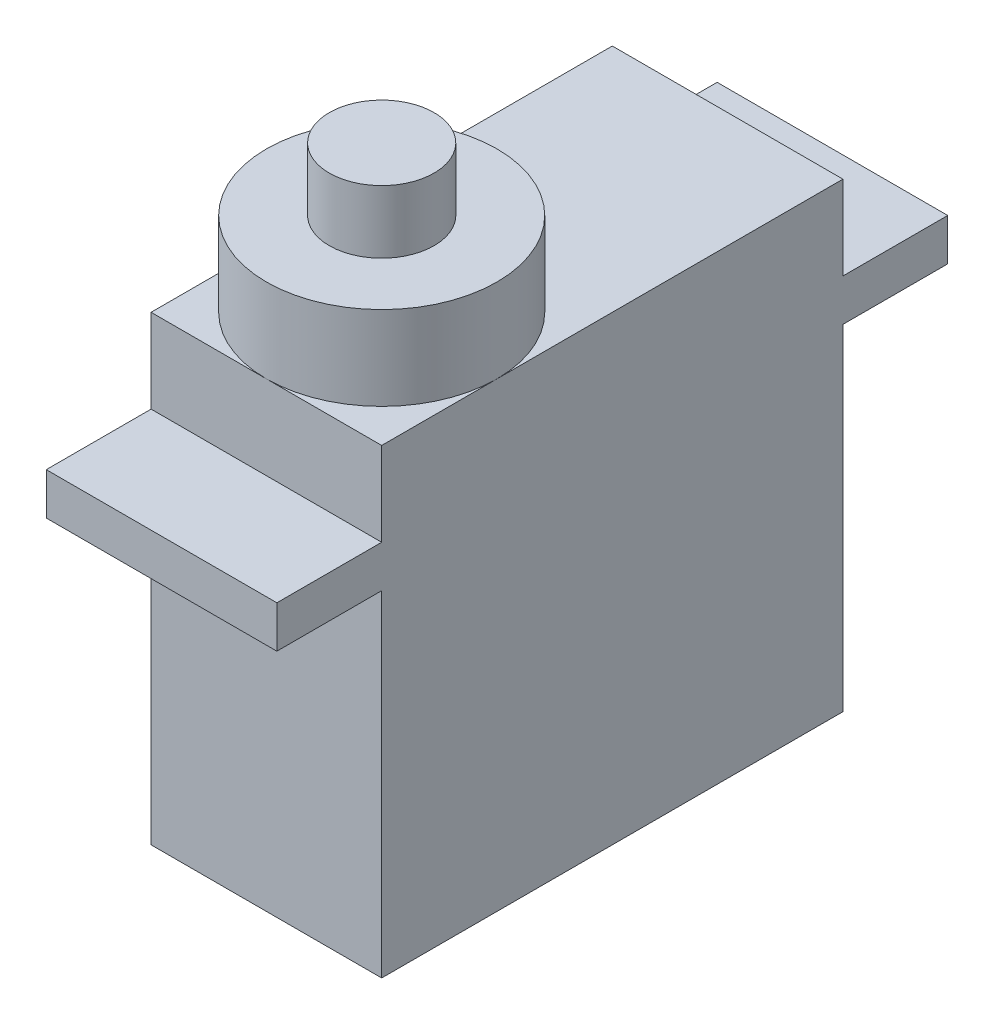
ISO-10303-21;
HEADER;
FILE_DESCRIPTION(('STEP AP214'),'2;1');
FILE_NAME('part.step','',(''),(''),'','','');
FILE_SCHEMA(('AUTOMOTIVE_DESIGN { 1 0 10303 214 1 1 1 1 }'));
ENDSEC;
DATA;
#1=APPLICATION_CONTEXT('core data for automotive mechanical design processes');
#2=APPLICATION_PROTOCOL_DEFINITION('international standard','automotive_design',2000,#1);
#3=PRODUCT_CONTEXT('',#1,'mechanical');
#4=PRODUCT('Part','Part','',(#3));
#5=PRODUCT_RELATED_PRODUCT_CATEGORY('part','',(#4));
#6=PRODUCT_DEFINITION_FORMATION('','',#4);
#7=PRODUCT_DEFINITION_CONTEXT('part definition',#1,'design');
#8=PRODUCT_DEFINITION('design','',#6,#7);
#9=PRODUCT_DEFINITION_SHAPE('','',#8);
#10=(LENGTH_UNIT() NAMED_UNIT(*) SI_UNIT(.MILLI.,.METRE.));
#11=(NAMED_UNIT(*) PLANE_ANGLE_UNIT() SI_UNIT($,.RADIAN.));
#12=(NAMED_UNIT(*) SI_UNIT($,.STERADIAN.) SOLID_ANGLE_UNIT());
#13=UNCERTAINTY_MEASURE_WITH_UNIT(LENGTH_MEASURE(1.E-05),#10,'distance_accuracy_value','');
#14=(GEOMETRIC_REPRESENTATION_CONTEXT(3) GLOBAL_UNCERTAINTY_ASSIGNED_CONTEXT((#13)) GLOBAL_UNIT_ASSIGNED_CONTEXT((#10,
#11,#12)) REPRESENTATION_CONTEXT('',''));
#15=CARTESIAN_POINT('',(0.,0.,0.));
#16=DIRECTION('',(0.,0.,1.));
#17=DIRECTION('',(1.,0.,0.));
#18=AXIS2_PLACEMENT_3D('',#15,#16,#17);
#19=CARTESIAN_POINT('',(0.,22.,0.));
#20=DIRECTION('',(0.,1.,0.));
#21=DIRECTION('',(0.,0.,1.));
#22=AXIS2_PLACEMENT_3D('',#19,#20,#21);
#23=PLANE('',#22);
#24=CARTESIAN_POINT('',(0.,22.,5.5));
#25=DIRECTION('',(0.,1.,0.));
#26=DIRECTION('',(0.,0.,1.));
#27=AXIS2_PLACEMENT_3D('',#24,#25,#26);
#28=CIRCLE('',#27,5.5);
#29=CARTESIAN_POINT('',(0.,22.,11.));
#30=VERTEX_POINT('',#29);
#31=CARTESIAN_POINT('',(5.5,22.,5.5));
#32=VERTEX_POINT('',#31);
#33=EDGE_CURVE('E159',#30,#32,#28,.T.);
#34=ORIENTED_EDGE('',*,*,#33,.F.);
#35=DIRECTION('',(1.,0.,0.));
#36=VECTOR('',#35,1.);
#37=CARTESIAN_POINT('',(5.5,22.,11.));
#38=LINE('',#37,#36);
#39=CARTESIAN_POINT('',(5.5,22.,11.));
#40=VERTEX_POINT('',#39);
#41=EDGE_CURVE('E146',#30,#40,#38,.T.);
#42=ORIENTED_EDGE('',*,*,#41,.T.);
#43=DIRECTION('',(0.,0.,-1.));
#44=VECTOR('',#43,1.);
#45=CARTESIAN_POINT('',(5.5,22.,11.));
#46=LINE('',#45,#44);
#47=EDGE_CURVE('E160',#40,#32,#46,.T.);
#48=ORIENTED_EDGE('',*,*,#47,.T.);
#49=EDGE_LOOP('',(#34,#42,#48));
#50=FACE_BOUND('',#49,.T.);
#51=ADVANCED_FACE('F39',(#50),#23,.T.);
#52=CARTESIAN_POINT('',(-5.5,22.,5.5));
#53=VERTEX_POINT('',#52);
#54=EDGE_CURVE('E49',#32,#53,#28,.T.);
#55=ORIENTED_EDGE('',*,*,#54,.F.);
#56=CARTESIAN_POINT('',(5.5,22.,-11.));
#57=VERTEX_POINT('',#56);
#58=EDGE_CURVE('E145',#32,#57,#46,.T.);
#59=ORIENTED_EDGE('',*,*,#58,.T.);
#60=DIRECTION('',(-1.,0.,0.));
#61=VECTOR('',#60,1.);
#62=CARTESIAN_POINT('',(5.5,22.,-11.));
#63=LINE('',#62,#61);
#64=CARTESIAN_POINT('',(-5.5,22.,-11.));
#65=VERTEX_POINT('',#64);
#66=EDGE_CURVE('E253',#57,#65,#63,.T.);
#67=ORIENTED_EDGE('',*,*,#66,.T.);
#68=DIRECTION('',(0.,0.,1.));
#69=VECTOR('',#68,1.);
#70=CARTESIAN_POINT('',(-5.5,22.,11.));
#71=LINE('',#70,#69);
#72=EDGE_CURVE('E157',#65,#53,#71,.T.);
#73=ORIENTED_EDGE('',*,*,#72,.T.);
#74=EDGE_LOOP('',(#55,#59,#67,#73));
#75=FACE_BOUND('',#74,.T.);
#76=ADVANCED_FACE('F334',(#75),#23,.T.);
#77=CARTESIAN_POINT('',(5.5,22.,11.));
#78=DIRECTION('',(0.,0.,-1.));
#79=DIRECTION('',(-1.,0.,0.));
#80=AXIS2_PLACEMENT_3D('',#77,#78,#79);
#81=PLANE('',#80);
#82=DIRECTION('',(-1.,0.,0.));
#83=VECTOR('',#82,1.);
#84=CARTESIAN_POINT('',(5.5,18.,11.));
#85=LINE('',#84,#83);
#86=CARTESIAN_POINT('',(5.5,18.,11.));
#87=VERTEX_POINT('',#86);
#88=CARTESIAN_POINT('',(-5.5,18.,11.));
#89=VERTEX_POINT('',#88);
#90=EDGE_CURVE('E189',#87,#89,#85,.T.);
#91=ORIENTED_EDGE('',*,*,#90,.F.);
#92=DIRECTION('',(0.,-1.,0.));
#93=VECTOR('',#92,1.);
#94=CARTESIAN_POINT('',(5.5,22.,11.));
#95=LINE('',#94,#93);
#96=EDGE_CURVE('E152',#40,#87,#95,.T.);
#97=ORIENTED_EDGE('',*,*,#96,.F.);
#98=ORIENTED_EDGE('',*,*,#41,.F.);
#99=CARTESIAN_POINT('',(-5.5,22.,11.));
#100=VERTEX_POINT('',#99);
#101=EDGE_CURVE('E138',#100,#30,#38,.T.);
#102=ORIENTED_EDGE('',*,*,#101,.F.);
#103=DIRECTION('',(0.,-1.,0.));
#104=VECTOR('',#103,1.);
#105=CARTESIAN_POINT('',(-5.5,22.,11.));
#106=LINE('',#105,#104);
#107=EDGE_CURVE('E43',#100,#89,#106,.T.);
#108=ORIENTED_EDGE('',*,*,#107,.T.);
#109=EDGE_LOOP('',(#91,#97,#98,#102,#108));
#110=FACE_BOUND('',#109,.T.);
#111=ADVANCED_FACE('F150',(#110),#81,.F.);
#112=CARTESIAN_POINT('',(5.5,22.,-11.));
#113=DIRECTION('',(0.,0.,1.));
#114=DIRECTION('',(1.,0.,0.));
#115=AXIS2_PLACEMENT_3D('',#112,#113,#114);
#116=PLANE('',#115);
#117=DIRECTION('',(-1.,0.,0.));
#118=VECTOR('',#117,1.);
#119=CARTESIAN_POINT('',(5.5,16.,-11.));
#120=LINE('',#119,#118);
#121=CARTESIAN_POINT('',(5.5,16.,-11.));
#122=VERTEX_POINT('',#121);
#123=CARTESIAN_POINT('',(-5.5,16.,-11.));
#124=VERTEX_POINT('',#123);
#125=EDGE_CURVE('E210',#122,#124,#120,.T.);
#126=ORIENTED_EDGE('',*,*,#125,.F.);
#127=DIRECTION('',(0.,-1.,0.));
#128=VECTOR('',#127,1.);
#129=CARTESIAN_POINT('',(5.5,22.,-11.));
#130=LINE('',#129,#128);
#131=CARTESIAN_POINT('',(5.5,0.,-11.));
#132=VERTEX_POINT('',#131);
#133=EDGE_CURVE('E276',#122,#132,#130,.T.);
#134=ORIENTED_EDGE('',*,*,#133,.T.);
#135=DIRECTION('',(-1.,0.,0.));
#136=VECTOR('',#135,1.);
#137=CARTESIAN_POINT('',(5.5,0.,-11.));
#138=LINE('',#137,#136);
#139=CARTESIAN_POINT('',(-5.5,0.,-11.));
#140=VERTEX_POINT('',#139);
#141=EDGE_CURVE('E268',#132,#140,#138,.T.);
#142=ORIENTED_EDGE('',*,*,#141,.T.);
#143=DIRECTION('',(0.,-1.,0.));
#144=VECTOR('',#143,1.);
#145=CARTESIAN_POINT('',(-5.5,22.,-11.));
#146=LINE('',#145,#144);
#147=EDGE_CURVE('E256',#124,#140,#146,.T.);
#148=ORIENTED_EDGE('',*,*,#147,.F.);
#149=EDGE_LOOP('',(#126,#134,#142,#148));
#150=FACE_BOUND('',#149,.T.);
#151=ADVANCED_FACE('F297',(#150),#116,.F.);
#152=CARTESIAN_POINT('',(-5.5,22.,11.));
#153=DIRECTION('',(1.,0.,0.));
#154=DIRECTION('',(0.,0.,-1.));
#155=AXIS2_PLACEMENT_3D('',#152,#153,#154);
#156=PLANE('',#155);
#157=DIRECTION('',(0.,0.,1.));
#158=VECTOR('',#157,1.);
#159=CARTESIAN_POINT('',(-5.5,0.,11.));
#160=LINE('',#159,#158);
#161=CARTESIAN_POINT('',(-5.5,0.,11.));
#162=VERTEX_POINT('',#161);
#163=EDGE_CURVE('E248',#140,#162,#160,.T.);
#164=ORIENTED_EDGE('',*,*,#163,.T.);
#165=CARTESIAN_POINT('',(-5.5,16.,11.));
#166=VERTEX_POINT('',#165);
#167=EDGE_CURVE('E170',#166,#162,#106,.T.);
#168=ORIENTED_EDGE('',*,*,#167,.F.);
#169=DIRECTION('',(0.,0.,-1.));
#170=VECTOR('',#169,1.);
#171=CARTESIAN_POINT('',(-5.5,16.,16.));
#172=LINE('',#171,#170);
#173=CARTESIAN_POINT('',(-5.5,16.,16.));
#174=VERTEX_POINT('',#173);
#175=EDGE_CURVE('E198',#174,#166,#172,.T.);
#176=ORIENTED_EDGE('',*,*,#175,.F.);
#177=DIRECTION('',(0.,-1.,0.));
#178=VECTOR('',#177,1.);
#179=CARTESIAN_POINT('',(-5.5,18.,16.));
#180=LINE('',#179,#178);
#181=CARTESIAN_POINT('',(-5.5,18.,16.));
#182=VERTEX_POINT('',#181);
#183=EDGE_CURVE('E181',#182,#174,#180,.T.);
#184=ORIENTED_EDGE('',*,*,#183,.F.);
#185=DIRECTION('',(0.,0.,-1.));
#186=VECTOR('',#185,1.);
#187=CARTESIAN_POINT('',(-5.5,18.,16.));
#188=LINE('',#187,#186);
#189=EDGE_CURVE('E202',#182,#89,#188,.T.);
#190=ORIENTED_EDGE('',*,*,#189,.T.);
#191=ORIENTED_EDGE('',*,*,#107,.F.);
#192=EDGE_CURVE('E141',#53,#100,#71,.T.);
#193=ORIENTED_EDGE('',*,*,#192,.F.);
#194=ORIENTED_EDGE('',*,*,#72,.F.);
#195=CARTESIAN_POINT('',(-5.5,18.,-11.));
#196=VERTEX_POINT('',#195);
#197=EDGE_CURVE('E272',#65,#196,#146,.T.);
#198=ORIENTED_EDGE('',*,*,#197,.T.);
#199=DIRECTION('',(0.,0.,1.));
#200=VECTOR('',#199,1.);
#201=CARTESIAN_POINT('',(-5.5,18.,-16.));
#202=LINE('',#201,#200);
#203=CARTESIAN_POINT('',(-5.5,18.,-16.));
#204=VERTEX_POINT('',#203);
#205=EDGE_CURVE('E236',#204,#196,#202,.T.);
#206=ORIENTED_EDGE('',*,*,#205,.F.);
#207=DIRECTION('',(0.,-1.,0.));
#208=VECTOR('',#207,1.);
#209=CARTESIAN_POINT('',(-5.5,18.,-16.));
#210=LINE('',#209,#208);
#211=CARTESIAN_POINT('',(-5.5,16.,-16.));
#212=VERTEX_POINT('',#211);
#213=EDGE_CURVE('E219',#204,#212,#210,.T.);
#214=ORIENTED_EDGE('',*,*,#213,.T.);
#215=DIRECTION('',(0.,0.,1.));
#216=VECTOR('',#215,1.);
#217=CARTESIAN_POINT('',(-5.5,16.,-16.));
#218=LINE('',#217,#216);
#219=EDGE_CURVE('E240',#212,#124,#218,.T.);
#220=ORIENTED_EDGE('',*,*,#219,.T.);
#221=ORIENTED_EDGE('',*,*,#147,.T.);
#222=EDGE_LOOP('',(#164,#168,#176,#184,#190,#191,#193,#194,#198,#206,#214,#220,#221));
#223=FACE_BOUND('',#222,.T.);
#224=ADVANCED_FACE('F41',(#223),#156,.F.);
#225=CARTESIAN_POINT('',(5.5,16.,11.));
#226=VERTEX_POINT('',#225);
#227=CARTESIAN_POINT('',(5.5,0.,11.));
#228=VERTEX_POINT('',#227);
#229=EDGE_CURVE('E279',#226,#228,#95,.T.);
#230=ORIENTED_EDGE('',*,*,#229,.F.);
#231=DIRECTION('',(-1.,0.,0.));
#232=VECTOR('',#231,1.);
#233=CARTESIAN_POINT('',(5.5,16.,11.));
#234=LINE('',#233,#232);
#235=EDGE_CURVE('E178',#226,#166,#234,.T.);
#236=ORIENTED_EDGE('',*,*,#235,.T.);
#237=ORIENTED_EDGE('',*,*,#167,.T.);
#238=DIRECTION('',(1.,0.,0.));
#239=VECTOR('',#238,1.);
#240=CARTESIAN_POINT('',(5.5,0.,11.));
#241=LINE('',#240,#239);
#242=EDGE_CURVE('E260',#162,#228,#241,.T.);
#243=ORIENTED_EDGE('',*,*,#242,.T.);
#244=EDGE_LOOP('',(#230,#236,#237,#243));
#245=FACE_BOUND('',#244,.T.);
#246=ADVANCED_FACE('F291',(#245),#81,.F.);
#247=CARTESIAN_POINT('',(5.5,22.,11.));
#248=DIRECTION('',(-1.,0.,0.));
#249=DIRECTION('',(0.,0.,1.));
#250=AXIS2_PLACEMENT_3D('',#247,#248,#249);
#251=PLANE('',#250);
#252=DIRECTION('',(0.,0.,-1.));
#253=VECTOR('',#252,1.);
#254=CARTESIAN_POINT('',(5.5,0.,11.));
#255=LINE('',#254,#253);
#256=EDGE_CURVE('E264',#228,#132,#255,.T.);
#257=ORIENTED_EDGE('',*,*,#256,.T.);
#258=ORIENTED_EDGE('',*,*,#133,.F.);
#259=DIRECTION('',(0.,0.,1.));
#260=VECTOR('',#259,1.);
#261=CARTESIAN_POINT('',(5.5,16.,-16.));
#262=LINE('',#261,#260);
#263=CARTESIAN_POINT('',(5.5,16.,-16.));
#264=VERTEX_POINT('',#263);
#265=EDGE_CURVE('E244',#264,#122,#262,.T.);
#266=ORIENTED_EDGE('',*,*,#265,.F.);
#267=DIRECTION('',(0.,-1.,0.));
#268=VECTOR('',#267,1.);
#269=CARTESIAN_POINT('',(5.5,18.,-16.));
#270=LINE('',#269,#268);
#271=CARTESIAN_POINT('',(5.5,18.,-16.));
#272=VERTEX_POINT('',#271);
#273=EDGE_CURVE('E211',#272,#264,#270,.T.);
#274=ORIENTED_EDGE('',*,*,#273,.F.);
#275=DIRECTION('',(0.,0.,1.));
#276=VECTOR('',#275,1.);
#277=CARTESIAN_POINT('',(5.5,18.,-16.));
#278=LINE('',#277,#276);
#279=CARTESIAN_POINT('',(5.5,18.,-11.));
#280=VERTEX_POINT('',#279);
#281=EDGE_CURVE('E227',#272,#280,#278,.T.);
#282=ORIENTED_EDGE('',*,*,#281,.T.);
#283=EDGE_CURVE('E277',#57,#280,#130,.T.);
#284=ORIENTED_EDGE('',*,*,#283,.F.);
#285=ORIENTED_EDGE('',*,*,#58,.F.);
#286=ORIENTED_EDGE('',*,*,#47,.F.);
#287=ORIENTED_EDGE('',*,*,#96,.T.);
#288=DIRECTION('',(0.,0.,-1.));
#289=VECTOR('',#288,1.);
#290=CARTESIAN_POINT('',(5.5,18.,16.));
#291=LINE('',#290,#289);
#292=CARTESIAN_POINT('',(5.5,18.,16.));
#293=VERTEX_POINT('',#292);
#294=EDGE_CURVE('E206',#293,#87,#291,.T.);
#295=ORIENTED_EDGE('',*,*,#294,.F.);
#296=DIRECTION('',(0.,-1.,0.));
#297=VECTOR('',#296,1.);
#298=CARTESIAN_POINT('',(5.5,18.,16.));
#299=LINE('',#298,#297);
#300=CARTESIAN_POINT('',(5.5,16.,16.));
#301=VERTEX_POINT('',#300);
#302=EDGE_CURVE('E173',#293,#301,#299,.T.);
#303=ORIENTED_EDGE('',*,*,#302,.T.);
#304=DIRECTION('',(0.,0.,-1.));
#305=VECTOR('',#304,1.);
#306=CARTESIAN_POINT('',(5.5,16.,16.));
#307=LINE('',#306,#305);
#308=EDGE_CURVE('E188',#301,#226,#307,.T.);
#309=ORIENTED_EDGE('',*,*,#308,.T.);
#310=ORIENTED_EDGE('',*,*,#229,.T.);
#311=EDGE_LOOP('',(#257,#258,#266,#274,#282,#284,#285,#286,#287,#295,#303,#309,#310));
#312=FACE_BOUND('',#311,.T.);
#313=ADVANCED_FACE('F284',(#312),#251,.F.);
#314=ORIENTED_EDGE('',*,*,#283,.T.);
#315=DIRECTION('',(-1.,0.,0.));
#316=VECTOR('',#315,1.);
#317=CARTESIAN_POINT('',(5.5,18.,-11.));
#318=LINE('',#317,#316);
#319=EDGE_CURVE('E216',#280,#196,#318,.T.);
#320=ORIENTED_EDGE('',*,*,#319,.T.);
#321=ORIENTED_EDGE('',*,*,#197,.F.);
#322=ORIENTED_EDGE('',*,*,#66,.F.);
#323=EDGE_LOOP('',(#314,#320,#321,#322));
#324=FACE_BOUND('',#323,.T.);
#325=ADVANCED_FACE('F342',(#324),#116,.F.);
#326=EDGE_CURVE('E64',#53,#30,#28,.T.);
#327=ORIENTED_EDGE('',*,*,#326,.F.);
#328=ORIENTED_EDGE('',*,*,#192,.T.);
#329=ORIENTED_EDGE('',*,*,#101,.T.);
#330=EDGE_LOOP('',(#327,#328,#329));
#331=FACE_BOUND('',#330,.T.);
#332=ADVANCED_FACE('F140',(#331),#23,.T.);
#333=CARTESIAN_POINT('',(0.,0.,0.));
#334=DIRECTION('',(0.,1.,0.));
#335=DIRECTION('',(0.,0.,1.));
#336=AXIS2_PLACEMENT_3D('',#333,#334,#335);
#337=PLANE('',#336);
#338=ORIENTED_EDGE('',*,*,#163,.F.);
#339=ORIENTED_EDGE('',*,*,#141,.F.);
#340=ORIENTED_EDGE('',*,*,#256,.F.);
#341=ORIENTED_EDGE('',*,*,#242,.F.);
#342=EDGE_LOOP('',(#338,#339,#340,#341));
#343=FACE_BOUND('',#342,.T.);
#344=ADVANCED_FACE('F295',(#343),#337,.F.);
#345=CARTESIAN_POINT('',(5.5,16.,-16.));
#346=DIRECTION('',(0.,1.,0.));
#347=DIRECTION('',(0.,0.,1.));
#348=AXIS2_PLACEMENT_3D('',#345,#346,#347);
#349=PLANE('',#348);
#350=ORIENTED_EDGE('',*,*,#125,.T.);
#351=ORIENTED_EDGE('',*,*,#219,.F.);
#352=DIRECTION('',(-1.,0.,0.));
#353=VECTOR('',#352,1.);
#354=CARTESIAN_POINT('',(5.5,16.,-16.));
#355=LINE('',#354,#353);
#356=EDGE_CURVE('E215',#264,#212,#355,.T.);
#357=ORIENTED_EDGE('',*,*,#356,.F.);
#358=ORIENTED_EDGE('',*,*,#265,.T.);
#359=EDGE_LOOP('',(#350,#351,#357,#358));
#360=FACE_BOUND('',#359,.T.);
#361=ADVANCED_FACE('F347',(#360),#349,.F.);
#362=CARTESIAN_POINT('',(5.5,18.,-16.));
#363=DIRECTION('',(0.,1.,0.));
#364=DIRECTION('',(0.,0.,1.));
#365=AXIS2_PLACEMENT_3D('',#362,#363,#364);
#366=PLANE('',#365);
#367=ORIENTED_EDGE('',*,*,#319,.F.);
#368=ORIENTED_EDGE('',*,*,#281,.F.);
#369=DIRECTION('',(-1.,0.,0.));
#370=VECTOR('',#369,1.);
#371=CARTESIAN_POINT('',(5.5,18.,-16.));
#372=LINE('',#371,#370);
#373=EDGE_CURVE('E223',#272,#204,#372,.T.);
#374=ORIENTED_EDGE('',*,*,#373,.T.);
#375=ORIENTED_EDGE('',*,*,#205,.T.);
#376=EDGE_LOOP('',(#367,#368,#374,#375));
#377=FACE_BOUND('',#376,.T.);
#378=ADVANCED_FACE('F447',(#377),#366,.T.);
#379=CARTESIAN_POINT('',(0.,0.,-16.));
#380=DIRECTION('',(0.,0.,-1.));
#381=DIRECTION('',(-1.,0.,0.));
#382=AXIS2_PLACEMENT_3D('',#379,#380,#381);
#383=PLANE('',#382);
#384=ORIENTED_EDGE('',*,*,#273,.T.);
#385=ORIENTED_EDGE('',*,*,#356,.T.);
#386=ORIENTED_EDGE('',*,*,#213,.F.);
#387=ORIENTED_EDGE('',*,*,#373,.F.);
#388=EDGE_LOOP('',(#384,#385,#386,#387));
#389=FACE_BOUND('',#388,.T.);
#390=ADVANCED_FACE('F437',(#389),#383,.T.);
#391=CARTESIAN_POINT('',(5.5,18.,16.));
#392=DIRECTION('',(0.,-1.,0.));
#393=DIRECTION('',(0.,0.,-1.));
#394=AXIS2_PLACEMENT_3D('',#391,#392,#393);
#395=PLANE('',#394);
#396=ORIENTED_EDGE('',*,*,#90,.T.);
#397=ORIENTED_EDGE('',*,*,#189,.F.);
#398=DIRECTION('',(-1.,0.,0.));
#399=VECTOR('',#398,1.);
#400=CARTESIAN_POINT('',(5.5,18.,16.));
#401=LINE('',#400,#399);
#402=EDGE_CURVE('E177',#293,#182,#401,.T.);
#403=ORIENTED_EDGE('',*,*,#402,.F.);
#404=ORIENTED_EDGE('',*,*,#294,.T.);
#405=EDGE_LOOP('',(#396,#397,#403,#404));
#406=FACE_BOUND('',#405,.T.);
#407=ADVANCED_FACE('F430',(#406),#395,.F.);
#408=CARTESIAN_POINT('',(5.5,16.,16.));
#409=DIRECTION('',(0.,-1.,0.));
#410=DIRECTION('',(0.,0.,-1.));
#411=AXIS2_PLACEMENT_3D('',#408,#409,#410);
#412=PLANE('',#411);
#413=ORIENTED_EDGE('',*,*,#235,.F.);
#414=ORIENTED_EDGE('',*,*,#308,.F.);
#415=DIRECTION('',(-1.,0.,0.));
#416=VECTOR('',#415,1.);
#417=CARTESIAN_POINT('',(5.5,16.,16.));
#418=LINE('',#417,#416);
#419=EDGE_CURVE('E184',#301,#174,#418,.T.);
#420=ORIENTED_EDGE('',*,*,#419,.T.);
#421=ORIENTED_EDGE('',*,*,#175,.T.);
#422=EDGE_LOOP('',(#413,#414,#420,#421));
#423=FACE_BOUND('',#422,.T.);
#424=ADVANCED_FACE('F330',(#423),#412,.T.);
#425=CARTESIAN_POINT('',(0.,0.,16.));
#426=DIRECTION('',(0.,0.,1.));
#427=DIRECTION('',(-1.,0.,0.));
#428=AXIS2_PLACEMENT_3D('',#425,#426,#427);
#429=PLANE('',#428);
#430=ORIENTED_EDGE('',*,*,#302,.F.);
#431=ORIENTED_EDGE('',*,*,#402,.T.);
#432=ORIENTED_EDGE('',*,*,#183,.T.);
#433=ORIENTED_EDGE('',*,*,#419,.F.);
#434=EDGE_LOOP('',(#430,#431,#432,#433));
#435=FACE_BOUND('',#434,.T.);
#436=ADVANCED_FACE('F325',(#435),#429,.T.);
#437=CARTESIAN_POINT('',(0.,26.,5.5));
#438=DIRECTION('',(0.,-1.,0.));
#439=DIRECTION('',(0.,0.,-1.));
#440=AXIS2_PLACEMENT_3D('',#437,#438,#439);
#441=CYLINDRICAL_SURFACE('',#440,5.5);
#442=CARTESIAN_POINT('',(0.,26.,5.5));
#443=DIRECTION('',(0.,1.,0.));
#444=DIRECTION('',(0.,0.,1.));
#445=AXIS2_PLACEMENT_3D('',#442,#443,#444);
#446=CIRCLE('',#445,5.5);
#447=CARTESIAN_POINT('',(0.,26.,11.));
#448=VERTEX_POINT('',#447);
#449=EDGE_CURVE('E163',#448,#448,#446,.T.);
#450=ORIENTED_EDGE('',*,*,#449,.F.);
#451=EDGE_LOOP('',(#450));
#452=FACE_BOUND('',#451,.T.);
#453=ORIENTED_EDGE('',*,*,#33,.T.);
#454=ORIENTED_EDGE('',*,*,#54,.T.);
#455=ORIENTED_EDGE('',*,*,#326,.T.);
#456=EDGE_LOOP('',(#453,#454,#455));
#457=FACE_BOUND('',#456,.T.);
#458=ADVANCED_FACE('F166',(#452,#457),#441,.T.);
#459=CARTESIAN_POINT('',(0.,26.,5.5));
#460=DIRECTION('',(0.,1.,0.));
#461=DIRECTION('',(0.,0.,1.));
#462=AXIS2_PLACEMENT_3D('',#459,#460,#461);
#463=PLANE('',#462);
#464=CARTESIAN_POINT('',(0.,26.,5.5));
#465=DIRECTION('',(0.,1.,0.));
#466=DIRECTION('',(0.,0.,1.));
#467=AXIS2_PLACEMENT_3D('',#464,#465,#466);
#468=CIRCLE('',#467,2.5);
#469=CARTESIAN_POINT('',(0.,26.,8.));
#470=VERTEX_POINT('',#469);
#471=EDGE_CURVE('E11',#470,#470,#468,.T.);
#472=ORIENTED_EDGE('',*,*,#471,.F.);
#473=EDGE_LOOP('',(#472));
#474=FACE_BOUND('',#473,.T.);
#475=ORIENTED_EDGE('',*,*,#449,.T.);
#476=EDGE_LOOP('',(#475));
#477=FACE_BOUND('',#476,.T.);
#478=ADVANCED_FACE('F315',(#474,#477),#463,.T.);
#479=CARTESIAN_POINT('',(0.,29.,5.5));
#480=DIRECTION('',(0.,-1.,0.));
#481=DIRECTION('',(0.,0.,-1.));
#482=AXIS2_PLACEMENT_3D('',#479,#480,#481);
#483=CYLINDRICAL_SURFACE('',#482,2.5);
#484=CARTESIAN_POINT('',(0.,29.,5.5));
#485=DIRECTION('',(0.,1.,0.));
#486=DIRECTION('',(0.,0.,1.));
#487=AXIS2_PLACEMENT_3D('',#484,#485,#486);
#488=CIRCLE('',#487,2.5);
#489=CARTESIAN_POINT('',(0.,29.,8.));
#490=VERTEX_POINT('',#489);
#491=EDGE_CURVE('E164',#490,#490,#488,.T.);
#492=ORIENTED_EDGE('',*,*,#491,.F.);
#493=EDGE_LOOP('',(#492));
#494=FACE_BOUND('',#493,.T.);
#495=ORIENTED_EDGE('',*,*,#471,.T.);
#496=EDGE_LOOP('',(#495));
#497=FACE_BOUND('',#496,.T.);
#498=ADVANCED_FACE('F312',(#494,#497),#483,.T.);
#499=CARTESIAN_POINT('',(0.,29.,5.5));
#500=DIRECTION('',(0.,1.,0.));
#501=DIRECTION('',(0.,0.,1.));
#502=AXIS2_PLACEMENT_3D('',#499,#500,#501);
#503=PLANE('',#502);
#504=ORIENTED_EDGE('',*,*,#491,.T.);
#505=EDGE_LOOP('',(#504));
#506=FACE_BOUND('',#505,.T.);
#507=ADVANCED_FACE('F310',(#506),#503,.T.);
#508=CLOSED_SHELL('',(#51,#76,#111,#151,#224,#246,#313,#325,#332,#344,#361,#378,#390,#407,#424,
#436,#458,#478,#498,#507));
#509=MANIFOLD_SOLID_BREP('B2',#508);
#510=ADVANCED_BREP_SHAPE_REPRESENTATION('',(#18,#509),#14);
#511=SHAPE_DEFINITION_REPRESENTATION(#9,#510);
ENDSEC;
END-ISO-10303-21;
